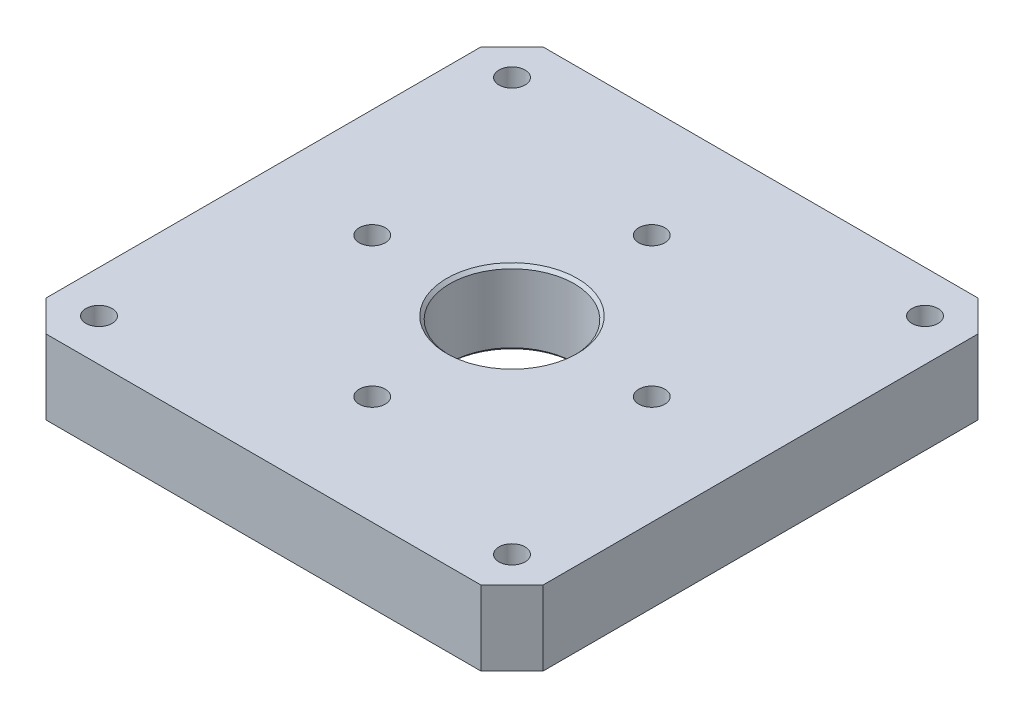
ISO-10303-21;
HEADER;
FILE_DESCRIPTION(('STEP AP214'),'2;1');
FILE_NAME('part.step','',(''),(''),'','','');
FILE_SCHEMA(('AUTOMOTIVE_DESIGN { 1 0 10303 214 1 1 1 1 }'));
ENDSEC;
DATA;
#1=APPLICATION_CONTEXT('core data for automotive mechanical design processes');
#2=APPLICATION_PROTOCOL_DEFINITION('international standard','automotive_design',2000,#1);
#3=PRODUCT_CONTEXT('',#1,'mechanical');
#4=PRODUCT('Part','Part','',(#3));
#5=PRODUCT_RELATED_PRODUCT_CATEGORY('part','',(#4));
#6=PRODUCT_DEFINITION_FORMATION('','',#4);
#7=PRODUCT_DEFINITION_CONTEXT('part definition',#1,'design');
#8=PRODUCT_DEFINITION('design','',#6,#7);
#9=PRODUCT_DEFINITION_SHAPE('','',#8);
#10=(LENGTH_UNIT() NAMED_UNIT(*) SI_UNIT(.MILLI.,.METRE.));
#11=(NAMED_UNIT(*) PLANE_ANGLE_UNIT() SI_UNIT($,.RADIAN.));
#12=(NAMED_UNIT(*) SI_UNIT($,.STERADIAN.) SOLID_ANGLE_UNIT());
#13=UNCERTAINTY_MEASURE_WITH_UNIT(LENGTH_MEASURE(1.E-05),#10,'distance_accuracy_value','');
#14=(GEOMETRIC_REPRESENTATION_CONTEXT(3) GLOBAL_UNCERTAINTY_ASSIGNED_CONTEXT((#13)) GLOBAL_UNIT_ASSIGNED_CONTEXT((#10,
#11,#12)) REPRESENTATION_CONTEXT('',''));
#15=CARTESIAN_POINT('',(0.,0.,0.));
#16=DIRECTION('',(0.,0.,1.));
#17=DIRECTION('',(1.,0.,0.));
#18=AXIS2_PLACEMENT_3D('',#15,#16,#17);
#19=CARTESIAN_POINT('',(0.,12.,0.));
#20=DIRECTION('',(0.,-1.,0.));
#21=DIRECTION('',(0.,0.,-1.));
#22=AXIS2_PLACEMENT_3D('',#19,#20,#21);
#23=PLANE('',#22);
#24=CARTESIAN_POINT('',(40.,12.,-40.));
#25=DIRECTION('',(0.,-1.,0.));
#26=DIRECTION('',(0.,0.,-1.));
#27=AXIS2_PLACEMENT_3D('',#24,#25,#26);
#28=CIRCLE('',#27,10.5);
#29=CARTESIAN_POINT('',(40.,12.,-50.5));
#30=VERTEX_POINT('',#29);
#31=EDGE_CURVE('E11',#30,#30,#28,.T.);
#32=ORIENTED_EDGE('',*,*,#31,.T.);
#33=EDGE_LOOP('',(#32));
#34=FACE_BOUND('',#33,.T.);
#35=CARTESIAN_POINT('',(6.76598128423227,12.,-73.2340187157677));
#36=DIRECTION('',(0.,1.,0.));
#37=DIRECTION('',(0.,0.,1.));
#38=AXIS2_PLACEMENT_3D('',#35,#36,#37);
#39=CIRCLE('',#38,2.1);
#40=CARTESIAN_POINT('',(6.76598128423227,12.,-71.1340187157677));
#41=VERTEX_POINT('',#40);
#42=EDGE_CURVE('E529',#41,#41,#39,.T.);
#43=ORIENTED_EDGE('',*,*,#42,.F.);
#44=EDGE_LOOP('',(#43));
#45=FACE_BOUND('',#44,.T.);
#46=CARTESIAN_POINT('',(73.2340187157677,12.,-73.2340187157677));
#47=DIRECTION('',(0.,1.,0.));
#48=DIRECTION('',(0.,0.,1.));
#49=AXIS2_PLACEMENT_3D('',#46,#47,#48);
#50=CIRCLE('',#49,2.1);
#51=CARTESIAN_POINT('',(73.2340187157677,12.,-71.1340187157677));
#52=VERTEX_POINT('',#51);
#53=EDGE_CURVE('E517',#52,#52,#50,.T.);
#54=ORIENTED_EDGE('',*,*,#53,.F.);
#55=EDGE_LOOP('',(#54));
#56=FACE_BOUND('',#55,.T.);
#57=CARTESIAN_POINT('',(62.5,12.,-40.));
#58=DIRECTION('',(0.,1.,0.));
#59=DIRECTION('',(0.,0.,1.));
#60=AXIS2_PLACEMENT_3D('',#57,#58,#59);
#61=CIRCLE('',#60,2.1);
#62=CARTESIAN_POINT('',(62.5,12.,-37.9));
#63=VERTEX_POINT('',#62);
#64=EDGE_CURVE('E511',#63,#63,#61,.T.);
#65=ORIENTED_EDGE('',*,*,#64,.F.);
#66=EDGE_LOOP('',(#65));
#67=FACE_BOUND('',#66,.T.);
#68=CARTESIAN_POINT('',(40.,12.,-17.5));
#69=DIRECTION('',(0.,1.,0.));
#70=DIRECTION('',(0.,0.,1.));
#71=AXIS2_PLACEMENT_3D('',#68,#69,#70);
#72=CIRCLE('',#71,2.1);
#73=CARTESIAN_POINT('',(40.,12.,-15.4));
#74=VERTEX_POINT('',#73);
#75=EDGE_CURVE('E505',#74,#74,#72,.T.);
#76=ORIENTED_EDGE('',*,*,#75,.F.);
#77=EDGE_LOOP('',(#76));
#78=FACE_BOUND('',#77,.T.);
#79=CARTESIAN_POINT('',(17.5,12.,-40.));
#80=DIRECTION('',(0.,1.,0.));
#81=DIRECTION('',(0.,0.,1.));
#82=AXIS2_PLACEMENT_3D('',#79,#80,#81);
#83=CIRCLE('',#82,2.1);
#84=CARTESIAN_POINT('',(17.5,12.,-37.9));
#85=VERTEX_POINT('',#84);
#86=EDGE_CURVE('E499',#85,#85,#83,.T.);
#87=ORIENTED_EDGE('',*,*,#86,.F.);
#88=EDGE_LOOP('',(#87));
#89=FACE_BOUND('',#88,.T.);
#90=CARTESIAN_POINT('',(6.76598128423226,12.,-6.76598128423226));
#91=DIRECTION('',(0.,1.,0.));
#92=DIRECTION('',(0.,0.,1.));
#93=AXIS2_PLACEMENT_3D('',#90,#91,#92);
#94=CIRCLE('',#93,2.1);
#95=CARTESIAN_POINT('',(6.76598128423226,12.,-4.66598128423226));
#96=VERTEX_POINT('',#95);
#97=EDGE_CURVE('E493',#96,#96,#94,.T.);
#98=ORIENTED_EDGE('',*,*,#97,.F.);
#99=EDGE_LOOP('',(#98));
#100=FACE_BOUND('',#99,.T.);
#101=CARTESIAN_POINT('',(73.2340187157677,12.,-6.76598128423227));
#102=DIRECTION('',(0.,1.,0.));
#103=DIRECTION('',(0.,0.,1.));
#104=AXIS2_PLACEMENT_3D('',#101,#102,#103);
#105=CIRCLE('',#104,2.1);
#106=CARTESIAN_POINT('',(73.2340187157677,12.,-4.66598128423226));
#107=VERTEX_POINT('',#106);
#108=EDGE_CURVE('E487',#107,#107,#105,.T.);
#109=ORIENTED_EDGE('',*,*,#108,.F.);
#110=EDGE_LOOP('',(#109));
#111=FACE_BOUND('',#110,.T.);
#112=DIRECTION('',(0.,0.,1.));
#113=VECTOR('',#112,1.);
#114=CARTESIAN_POINT('',(0.,12.,-5.));
#115=LINE('',#114,#113);
#116=CARTESIAN_POINT('',(0.,12.,-75.));
#117=VERTEX_POINT('',#116);
#118=CARTESIAN_POINT('',(0.,12.,-5.));
#119=VERTEX_POINT('',#118);
#120=EDGE_CURVE('E184',#117,#119,#115,.T.);
#121=ORIENTED_EDGE('',*,*,#120,.T.);
#122=DIRECTION('',(0.707106781186548,0.,0.707106781186548));
#123=VECTOR('',#122,1.);
#124=CARTESIAN_POINT('',(0.,12.,-5.));
#125=LINE('',#124,#123);
#126=CARTESIAN_POINT('',(5.,12.,0.));
#127=VERTEX_POINT('',#126);
#128=EDGE_CURVE('E120',#119,#127,#125,.T.);
#129=ORIENTED_EDGE('',*,*,#128,.T.);
#130=DIRECTION('',(1.,0.,0.));
#131=VECTOR('',#130,1.);
#132=CARTESIAN_POINT('',(5.,12.,0.));
#133=LINE('',#132,#131);
#134=CARTESIAN_POINT('',(75.,12.,0.));
#135=VERTEX_POINT('',#134);
#136=EDGE_CURVE('E469',#127,#135,#133,.T.);
#137=ORIENTED_EDGE('',*,*,#136,.T.);
#138=DIRECTION('',(0.707106781186548,0.,-0.707106781186547));
#139=VECTOR('',#138,1.);
#140=CARTESIAN_POINT('',(75.,12.,0.));
#141=LINE('',#140,#139);
#142=CARTESIAN_POINT('',(80.,12.,-5.));
#143=VERTEX_POINT('',#142);
#144=EDGE_CURVE('E475',#135,#143,#141,.T.);
#145=ORIENTED_EDGE('',*,*,#144,.T.);
#146=DIRECTION('',(0.,0.,-1.));
#147=VECTOR('',#146,1.);
#148=CARTESIAN_POINT('',(80.,12.,-5.));
#149=LINE('',#148,#147);
#150=CARTESIAN_POINT('',(80.,12.,-75.));
#151=VERTEX_POINT('',#150);
#152=EDGE_CURVE('E139',#143,#151,#149,.T.);
#153=ORIENTED_EDGE('',*,*,#152,.T.);
#154=DIRECTION('',(-0.707106781186547,0.,-0.707106781186547));
#155=VECTOR('',#154,1.);
#156=CARTESIAN_POINT('',(75.,12.,-80.));
#157=LINE('',#156,#155);
#158=CARTESIAN_POINT('',(75.,12.,-80.));
#159=VERTEX_POINT('',#158);
#160=EDGE_CURVE('E133',#151,#159,#157,.T.);
#161=ORIENTED_EDGE('',*,*,#160,.T.);
#162=DIRECTION('',(-1.,0.,0.));
#163=VECTOR('',#162,1.);
#164=CARTESIAN_POINT('',(5.,12.,-80.));
#165=LINE('',#164,#163);
#166=CARTESIAN_POINT('',(5.,12.,-80.));
#167=VERTEX_POINT('',#166);
#168=EDGE_CURVE('E137',#159,#167,#165,.T.);
#169=ORIENTED_EDGE('',*,*,#168,.T.);
#170=DIRECTION('',(-0.707106781186547,0.,0.707106781186548));
#171=VECTOR('',#170,1.);
#172=CARTESIAN_POINT('',(0.,12.,-75.));
#173=LINE('',#172,#171);
#174=EDGE_CURVE('E76',#167,#117,#173,.T.);
#175=ORIENTED_EDGE('',*,*,#174,.T.);
#176=EDGE_LOOP('',(#121,#129,#137,#145,#153,#161,#169,#175));
#177=FACE_BOUND('',#176,.T.);
#178=CARTESIAN_POINT('',(40.,12.,-62.5));
#179=DIRECTION('',(0.,1.,0.));
#180=DIRECTION('',(0.,0.,1.));
#181=AXIS2_PLACEMENT_3D('',#178,#179,#180);
#182=CIRCLE('',#181,2.1);
#183=CARTESIAN_POINT('',(40.,12.,-60.4));
#184=VERTEX_POINT('',#183);
#185=EDGE_CURVE('E523',#184,#184,#182,.T.);
#186=ORIENTED_EDGE('',*,*,#185,.F.);
#187=EDGE_LOOP('',(#186));
#188=FACE_BOUND('',#187,.T.);
#189=ADVANCED_FACE('F57',(#34,#45,#56,#67,#78,#89,#100,#111,#177,#188),#23,.F.);
#190=CARTESIAN_POINT('',(0.,12.,-5.));
#191=DIRECTION('',(1.,0.,0.));
#192=DIRECTION('',(0.,0.,-1.));
#193=AXIS2_PLACEMENT_3D('',#190,#191,#192);
#194=PLANE('',#193);
#195=DIRECTION('',(0.,0.,1.));
#196=VECTOR('',#195,1.);
#197=CARTESIAN_POINT('',(0.,0.,-5.));
#198=LINE('',#197,#196);
#199=CARTESIAN_POINT('',(0.,0.,-75.));
#200=VERTEX_POINT('',#199);
#201=CARTESIAN_POINT('',(0.,0.,-5.));
#202=VERTEX_POINT('',#201);
#203=EDGE_CURVE('E161',#200,#202,#198,.T.);
#204=ORIENTED_EDGE('',*,*,#203,.T.);
#205=DIRECTION('',(0.,-1.,0.));
#206=VECTOR('',#205,1.);
#207=CARTESIAN_POINT('',(0.,12.,-5.));
#208=LINE('',#207,#206);
#209=EDGE_CURVE('E203',#119,#202,#208,.T.);
#210=ORIENTED_EDGE('',*,*,#209,.F.);
#211=ORIENTED_EDGE('',*,*,#120,.F.);
#212=DIRECTION('',(0.,-1.,0.));
#213=VECTOR('',#212,1.);
#214=CARTESIAN_POINT('',(0.,12.,-75.));
#215=LINE('',#214,#213);
#216=EDGE_CURVE('E157',#117,#200,#215,.T.);
#217=ORIENTED_EDGE('',*,*,#216,.T.);
#218=EDGE_LOOP('',(#204,#210,#211,#217));
#219=FACE_BOUND('',#218,.T.);
#220=ADVANCED_FACE('F266',(#219),#194,.F.);
#221=CARTESIAN_POINT('',(0.,12.,-5.));
#222=DIRECTION('',(0.707106781186547,0.,-0.707106781186547));
#223=DIRECTION('',(-0.707106781186548,0.,-0.707106781186548));
#224=AXIS2_PLACEMENT_3D('',#221,#222,#223);
#225=PLANE('',#224);
#226=DIRECTION('',(0.707106781186548,0.,0.707106781186548));
#227=VECTOR('',#226,1.);
#228=CARTESIAN_POINT('',(0.,0.,-5.));
#229=LINE('',#228,#227);
#230=CARTESIAN_POINT('',(5.,0.,0.));
#231=VERTEX_POINT('',#230);
#232=EDGE_CURVE('E165',#202,#231,#229,.T.);
#233=ORIENTED_EDGE('',*,*,#232,.T.);
#234=DIRECTION('',(0.,-1.,0.));
#235=VECTOR('',#234,1.);
#236=CARTESIAN_POINT('',(5.,12.,0.));
#237=LINE('',#236,#235);
#238=EDGE_CURVE('E199',#127,#231,#237,.T.);
#239=ORIENTED_EDGE('',*,*,#238,.F.);
#240=ORIENTED_EDGE('',*,*,#128,.F.);
#241=ORIENTED_EDGE('',*,*,#209,.T.);
#242=EDGE_LOOP('',(#233,#239,#240,#241));
#243=FACE_BOUND('',#242,.T.);
#244=ADVANCED_FACE('F282',(#243),#225,.F.);
#245=CARTESIAN_POINT('',(5.,12.,0.));
#246=DIRECTION('',(0.,0.,-1.));
#247=DIRECTION('',(-1.,0.,0.));
#248=AXIS2_PLACEMENT_3D('',#245,#246,#247);
#249=PLANE('',#248);
#250=DIRECTION('',(1.,0.,0.));
#251=VECTOR('',#250,1.);
#252=CARTESIAN_POINT('',(5.,0.,0.));
#253=LINE('',#252,#251);
#254=CARTESIAN_POINT('',(75.,0.,0.));
#255=VERTEX_POINT('',#254);
#256=EDGE_CURVE('E169',#231,#255,#253,.T.);
#257=ORIENTED_EDGE('',*,*,#256,.T.);
#258=DIRECTION('',(0.,-1.,0.));
#259=VECTOR('',#258,1.);
#260=CARTESIAN_POINT('',(75.,12.,0.));
#261=LINE('',#260,#259);
#262=EDGE_CURVE('E195',#135,#255,#261,.T.);
#263=ORIENTED_EDGE('',*,*,#262,.F.);
#264=ORIENTED_EDGE('',*,*,#136,.F.);
#265=ORIENTED_EDGE('',*,*,#238,.T.);
#266=EDGE_LOOP('',(#257,#263,#264,#265));
#267=FACE_BOUND('',#266,.T.);
#268=ADVANCED_FACE('F431',(#267),#249,.F.);
#269=CARTESIAN_POINT('',(75.,12.,0.));
#270=DIRECTION('',(-0.707106781186547,0.,-0.707106781186548));
#271=DIRECTION('',(-0.707106781186548,0.,0.707106781186547));
#272=AXIS2_PLACEMENT_3D('',#269,#270,#271);
#273=PLANE('',#272);
#274=DIRECTION('',(0.707106781186548,0.,-0.707106781186547));
#275=VECTOR('',#274,1.);
#276=CARTESIAN_POINT('',(75.,0.,0.));
#277=LINE('',#276,#275);
#278=CARTESIAN_POINT('',(80.,0.,-5.));
#279=VERTEX_POINT('',#278);
#280=EDGE_CURVE('E172',#255,#279,#277,.T.);
#281=ORIENTED_EDGE('',*,*,#280,.T.);
#282=DIRECTION('',(0.,-1.,0.));
#283=VECTOR('',#282,1.);
#284=CARTESIAN_POINT('',(80.,12.,-5.));
#285=LINE('',#284,#283);
#286=EDGE_CURVE('E191',#143,#279,#285,.T.);
#287=ORIENTED_EDGE('',*,*,#286,.F.);
#288=ORIENTED_EDGE('',*,*,#144,.F.);
#289=ORIENTED_EDGE('',*,*,#262,.T.);
#290=EDGE_LOOP('',(#281,#287,#288,#289));
#291=FACE_BOUND('',#290,.T.);
#292=ADVANCED_FACE('F422',(#291),#273,.F.);
#293=CARTESIAN_POINT('',(80.,12.,-5.));
#294=DIRECTION('',(-1.,0.,0.));
#295=DIRECTION('',(0.,0.,1.));
#296=AXIS2_PLACEMENT_3D('',#293,#294,#295);
#297=PLANE('',#296);
#298=DIRECTION('',(0.,0.,-1.));
#299=VECTOR('',#298,1.);
#300=CARTESIAN_POINT('',(80.,0.,-5.));
#301=LINE('',#300,#299);
#302=CARTESIAN_POINT('',(80.,0.,-75.));
#303=VERTEX_POINT('',#302);
#304=EDGE_CURVE('E175',#279,#303,#301,.T.);
#305=ORIENTED_EDGE('',*,*,#304,.T.);
#306=DIRECTION('',(0.,-1.,0.));
#307=VECTOR('',#306,1.);
#308=CARTESIAN_POINT('',(80.,12.,-75.));
#309=LINE('',#308,#307);
#310=EDGE_CURVE('E150',#151,#303,#309,.T.);
#311=ORIENTED_EDGE('',*,*,#310,.F.);
#312=ORIENTED_EDGE('',*,*,#152,.F.);
#313=ORIENTED_EDGE('',*,*,#286,.T.);
#314=EDGE_LOOP('',(#305,#311,#312,#313));
#315=FACE_BOUND('',#314,.T.);
#316=ADVANCED_FACE('F414',(#315),#297,.F.);
#317=CARTESIAN_POINT('',(75.,12.,-80.));
#318=DIRECTION('',(-0.707106781186548,0.,0.707106781186548));
#319=DIRECTION('',(0.707106781186548,0.,0.707106781186548));
#320=AXIS2_PLACEMENT_3D('',#317,#318,#319);
#321=PLANE('',#320);
#322=DIRECTION('',(-0.707106781186547,0.,-0.707106781186547));
#323=VECTOR('',#322,1.);
#324=CARTESIAN_POINT('',(75.,0.,-80.));
#325=LINE('',#324,#323);
#326=CARTESIAN_POINT('',(75.,0.,-80.));
#327=VERTEX_POINT('',#326);
#328=EDGE_CURVE('E148',#303,#327,#325,.T.);
#329=ORIENTED_EDGE('',*,*,#328,.T.);
#330=DIRECTION('',(0.,-1.,0.));
#331=VECTOR('',#330,1.);
#332=CARTESIAN_POINT('',(75.,12.,-80.));
#333=LINE('',#332,#331);
#334=EDGE_CURVE('E145',#159,#327,#333,.T.);
#335=ORIENTED_EDGE('',*,*,#334,.F.);
#336=ORIENTED_EDGE('',*,*,#160,.F.);
#337=ORIENTED_EDGE('',*,*,#310,.T.);
#338=EDGE_LOOP('',(#329,#335,#336,#337));
#339=FACE_BOUND('',#338,.T.);
#340=ADVANCED_FACE('F146',(#339),#321,.F.);
#341=CARTESIAN_POINT('',(5.,12.,-80.));
#342=DIRECTION('',(0.,0.,1.));
#343=DIRECTION('',(1.,0.,0.));
#344=AXIS2_PLACEMENT_3D('',#341,#342,#343);
#345=PLANE('',#344);
#346=DIRECTION('',(-1.,0.,0.));
#347=VECTOR('',#346,1.);
#348=CARTESIAN_POINT('',(5.,0.,-80.));
#349=LINE('',#348,#347);
#350=CARTESIAN_POINT('',(5.,0.,-80.));
#351=VERTEX_POINT('',#350);
#352=EDGE_CURVE('E105',#327,#351,#349,.T.);
#353=ORIENTED_EDGE('',*,*,#352,.T.);
#354=DIRECTION('',(0.,-1.,0.));
#355=VECTOR('',#354,1.);
#356=CARTESIAN_POINT('',(5.,12.,-80.));
#357=LINE('',#356,#355);
#358=EDGE_CURVE('E151',#167,#351,#357,.T.);
#359=ORIENTED_EDGE('',*,*,#358,.F.);
#360=ORIENTED_EDGE('',*,*,#168,.F.);
#361=ORIENTED_EDGE('',*,*,#334,.T.);
#362=EDGE_LOOP('',(#353,#359,#360,#361));
#363=FACE_BOUND('',#362,.T.);
#364=ADVANCED_FACE('F153',(#363),#345,.F.);
#365=CARTESIAN_POINT('',(0.,12.,-75.));
#366=DIRECTION('',(0.707106781186548,0.,0.707106781186547));
#367=DIRECTION('',(0.707106781186547,0.,-0.707106781186548));
#368=AXIS2_PLACEMENT_3D('',#365,#366,#367);
#369=PLANE('',#368);
#370=DIRECTION('',(-0.707106781186547,0.,0.707106781186548));
#371=VECTOR('',#370,1.);
#372=CARTESIAN_POINT('',(0.,0.,-75.));
#373=LINE('',#372,#371);
#374=EDGE_CURVE('E111',#351,#200,#373,.T.);
#375=ORIENTED_EDGE('',*,*,#374,.T.);
#376=ORIENTED_EDGE('',*,*,#216,.F.);
#377=ORIENTED_EDGE('',*,*,#174,.F.);
#378=ORIENTED_EDGE('',*,*,#358,.T.);
#379=EDGE_LOOP('',(#375,#376,#377,#378));
#380=FACE_BOUND('',#379,.T.);
#381=ADVANCED_FACE('F229',(#380),#369,.F.);
#382=CARTESIAN_POINT('',(0.,0.,0.));
#383=DIRECTION('',(0.,-1.,0.));
#384=DIRECTION('',(0.,0.,-1.));
#385=AXIS2_PLACEMENT_3D('',#382,#383,#384);
#386=PLANE('',#385);
#387=CARTESIAN_POINT('',(40.,0.,-40.));
#388=DIRECTION('',(0.,-1.,0.));
#389=DIRECTION('',(0.,0.,-1.));
#390=AXIS2_PLACEMENT_3D('',#387,#388,#389);
#391=CIRCLE('',#390,10.5);
#392=CARTESIAN_POINT('',(40.,0.,-50.5));
#393=VERTEX_POINT('',#392);
#394=EDGE_CURVE('E206',#393,#393,#391,.F.);
#395=ORIENTED_EDGE('',*,*,#394,.T.);
#396=EDGE_LOOP('',(#395));
#397=FACE_BOUND('',#396,.T.);
#398=CARTESIAN_POINT('',(6.76598128423227,0.,-73.2340187157677));
#399=DIRECTION('',(0.,1.,0.));
#400=DIRECTION('',(0.,0.,1.));
#401=AXIS2_PLACEMENT_3D('',#398,#399,#400);
#402=CIRCLE('',#401,2.1);
#403=CARTESIAN_POINT('',(6.76598128423227,0.,-71.1340187157677));
#404=VERTEX_POINT('',#403);
#405=EDGE_CURVE('E234',#404,#404,#402,.T.);
#406=ORIENTED_EDGE('',*,*,#405,.T.);
#407=EDGE_LOOP('',(#406));
#408=FACE_BOUND('',#407,.T.);
#409=CARTESIAN_POINT('',(40.,0.,-62.5));
#410=DIRECTION('',(0.,1.,0.));
#411=DIRECTION('',(0.,0.,1.));
#412=AXIS2_PLACEMENT_3D('',#409,#410,#411);
#413=CIRCLE('',#412,2.1);
#414=CARTESIAN_POINT('',(40.,0.,-60.4));
#415=VERTEX_POINT('',#414);
#416=EDGE_CURVE('E238',#415,#415,#413,.T.);
#417=ORIENTED_EDGE('',*,*,#416,.T.);
#418=EDGE_LOOP('',(#417));
#419=FACE_BOUND('',#418,.T.);
#420=CARTESIAN_POINT('',(73.2340187157677,0.,-73.2340187157677));
#421=DIRECTION('',(0.,1.,0.));
#422=DIRECTION('',(0.,0.,1.));
#423=AXIS2_PLACEMENT_3D('',#420,#421,#422);
#424=CIRCLE('',#423,2.09999999999999);
#425=CARTESIAN_POINT('',(73.2340187157677,0.,-71.1340187157677));
#426=VERTEX_POINT('',#425);
#427=EDGE_CURVE('E242',#426,#426,#424,.T.);
#428=ORIENTED_EDGE('',*,*,#427,.T.);
#429=EDGE_LOOP('',(#428));
#430=FACE_BOUND('',#429,.T.);
#431=CARTESIAN_POINT('',(62.5,0.,-40.));
#432=DIRECTION('',(0.,1.,0.));
#433=DIRECTION('',(0.,0.,1.));
#434=AXIS2_PLACEMENT_3D('',#431,#432,#433);
#435=CIRCLE('',#434,2.09999999999999);
#436=CARTESIAN_POINT('',(62.5,0.,-37.9));
#437=VERTEX_POINT('',#436);
#438=EDGE_CURVE('E246',#437,#437,#435,.T.);
#439=ORIENTED_EDGE('',*,*,#438,.T.);
#440=EDGE_LOOP('',(#439));
#441=FACE_BOUND('',#440,.T.);
#442=CARTESIAN_POINT('',(40.,0.,-17.5));
#443=DIRECTION('',(0.,1.,0.));
#444=DIRECTION('',(0.,0.,1.));
#445=AXIS2_PLACEMENT_3D('',#442,#443,#444);
#446=CIRCLE('',#445,2.1);
#447=CARTESIAN_POINT('',(40.,0.,-15.4));
#448=VERTEX_POINT('',#447);
#449=EDGE_CURVE('E250',#448,#448,#446,.T.);
#450=ORIENTED_EDGE('',*,*,#449,.T.);
#451=EDGE_LOOP('',(#450));
#452=FACE_BOUND('',#451,.T.);
#453=CARTESIAN_POINT('',(17.5,0.,-40.));
#454=DIRECTION('',(0.,1.,0.));
#455=DIRECTION('',(0.,0.,1.));
#456=AXIS2_PLACEMENT_3D('',#453,#454,#455);
#457=CIRCLE('',#456,2.1);
#458=CARTESIAN_POINT('',(17.5,0.,-37.9));
#459=VERTEX_POINT('',#458);
#460=EDGE_CURVE('E254',#459,#459,#457,.T.);
#461=ORIENTED_EDGE('',*,*,#460,.T.);
#462=EDGE_LOOP('',(#461));
#463=FACE_BOUND('',#462,.T.);
#464=CARTESIAN_POINT('',(6.76598128423226,0.,-6.76598128423226));
#465=DIRECTION('',(0.,1.,0.));
#466=DIRECTION('',(0.,0.,1.));
#467=AXIS2_PLACEMENT_3D('',#464,#465,#466);
#468=CIRCLE('',#467,2.1);
#469=CARTESIAN_POINT('',(6.76598128423226,0.,-4.66598128423226));
#470=VERTEX_POINT('',#469);
#471=EDGE_CURVE('E258',#470,#470,#468,.T.);
#472=ORIENTED_EDGE('',*,*,#471,.T.);
#473=EDGE_LOOP('',(#472));
#474=FACE_BOUND('',#473,.T.);
#475=CARTESIAN_POINT('',(73.2340187157677,0.,-6.76598128423227));
#476=DIRECTION('',(0.,1.,0.));
#477=DIRECTION('',(0.,0.,1.));
#478=AXIS2_PLACEMENT_3D('',#475,#476,#477);
#479=CIRCLE('',#478,2.09999999999999);
#480=CARTESIAN_POINT('',(73.2340187157677,0.,-4.66598128423228));
#481=VERTEX_POINT('',#480);
#482=EDGE_CURVE('E166',#481,#481,#479,.T.);
#483=ORIENTED_EDGE('',*,*,#482,.T.);
#484=EDGE_LOOP('',(#483));
#485=FACE_BOUND('',#484,.T.);
#486=ORIENTED_EDGE('',*,*,#203,.F.);
#487=ORIENTED_EDGE('',*,*,#374,.F.);
#488=ORIENTED_EDGE('',*,*,#352,.F.);
#489=ORIENTED_EDGE('',*,*,#328,.F.);
#490=ORIENTED_EDGE('',*,*,#304,.F.);
#491=ORIENTED_EDGE('',*,*,#280,.F.);
#492=ORIENTED_EDGE('',*,*,#256,.F.);
#493=ORIENTED_EDGE('',*,*,#232,.F.);
#494=EDGE_LOOP('',(#486,#487,#488,#489,#490,#491,#492,#493));
#495=FACE_BOUND('',#494,.T.);
#496=ADVANCED_FACE('F225',(#397,#408,#419,#430,#441,#452,#463,#474,#485,#495),#386,.T.);
#497=CARTESIAN_POINT('',(73.2340187157677,12.,-6.76598128423227));
#498=DIRECTION('',(0.,1.,0.));
#499=DIRECTION('',(0.,0.,1.));
#500=AXIS2_PLACEMENT_3D('',#497,#498,#499);
#501=CYLINDRICAL_SURFACE('',#500,2.1);
#502=ORIENTED_EDGE('',*,*,#482,.F.);
#503=EDGE_LOOP('',(#502));
#504=FACE_BOUND('',#503,.T.);
#505=ORIENTED_EDGE('',*,*,#108,.T.);
#506=EDGE_LOOP('',(#505));
#507=FACE_BOUND('',#506,.T.);
#508=ADVANCED_FACE('F228',(#504,#507),#501,.F.);
#509=CARTESIAN_POINT('',(6.76598128423226,12.,-6.76598128423226));
#510=DIRECTION('',(0.,1.,0.));
#511=DIRECTION('',(0.,0.,1.));
#512=AXIS2_PLACEMENT_3D('',#509,#510,#511);
#513=CYLINDRICAL_SURFACE('',#512,2.1);
#514=ORIENTED_EDGE('',*,*,#471,.F.);
#515=EDGE_LOOP('',(#514));
#516=FACE_BOUND('',#515,.T.);
#517=ORIENTED_EDGE('',*,*,#97,.T.);
#518=EDGE_LOOP('',(#517));
#519=FACE_BOUND('',#518,.T.);
#520=ADVANCED_FACE('F288',(#516,#519),#513,.F.);
#521=CARTESIAN_POINT('',(17.5,12.,-40.));
#522=DIRECTION('',(0.,1.,0.));
#523=DIRECTION('',(0.,0.,1.));
#524=AXIS2_PLACEMENT_3D('',#521,#522,#523);
#525=CYLINDRICAL_SURFACE('',#524,2.1);
#526=ORIENTED_EDGE('',*,*,#460,.F.);
#527=EDGE_LOOP('',(#526));
#528=FACE_BOUND('',#527,.T.);
#529=ORIENTED_EDGE('',*,*,#86,.T.);
#530=EDGE_LOOP('',(#529));
#531=FACE_BOUND('',#530,.T.);
#532=ADVANCED_FACE('F292',(#528,#531),#525,.F.);
#533=CARTESIAN_POINT('',(40.,12.,-17.5));
#534=DIRECTION('',(0.,1.,0.));
#535=DIRECTION('',(0.,0.,1.));
#536=AXIS2_PLACEMENT_3D('',#533,#534,#535);
#537=CYLINDRICAL_SURFACE('',#536,2.1);
#538=ORIENTED_EDGE('',*,*,#449,.F.);
#539=EDGE_LOOP('',(#538));
#540=FACE_BOUND('',#539,.T.);
#541=ORIENTED_EDGE('',*,*,#75,.T.);
#542=EDGE_LOOP('',(#541));
#543=FACE_BOUND('',#542,.T.);
#544=ADVANCED_FACE('F296',(#540,#543),#537,.F.);
#545=CARTESIAN_POINT('',(62.5,12.,-40.));
#546=DIRECTION('',(0.,1.,0.));
#547=DIRECTION('',(0.,0.,1.));
#548=AXIS2_PLACEMENT_3D('',#545,#546,#547);
#549=CYLINDRICAL_SURFACE('',#548,2.1);
#550=ORIENTED_EDGE('',*,*,#438,.F.);
#551=EDGE_LOOP('',(#550));
#552=FACE_BOUND('',#551,.T.);
#553=ORIENTED_EDGE('',*,*,#64,.T.);
#554=EDGE_LOOP('',(#553));
#555=FACE_BOUND('',#554,.T.);
#556=ADVANCED_FACE('F300',(#552,#555),#549,.F.);
#557=CARTESIAN_POINT('',(73.2340187157677,12.,-73.2340187157677));
#558=DIRECTION('',(0.,1.,0.));
#559=DIRECTION('',(0.,0.,1.));
#560=AXIS2_PLACEMENT_3D('',#557,#558,#559);
#561=CYLINDRICAL_SURFACE('',#560,2.1);
#562=ORIENTED_EDGE('',*,*,#427,.F.);
#563=EDGE_LOOP('',(#562));
#564=FACE_BOUND('',#563,.T.);
#565=ORIENTED_EDGE('',*,*,#53,.T.);
#566=EDGE_LOOP('',(#565));
#567=FACE_BOUND('',#566,.T.);
#568=ADVANCED_FACE('F304',(#564,#567),#561,.F.);
#569=CARTESIAN_POINT('',(40.,12.,-62.5));
#570=DIRECTION('',(0.,1.,0.));
#571=DIRECTION('',(0.,0.,1.));
#572=AXIS2_PLACEMENT_3D('',#569,#570,#571);
#573=CYLINDRICAL_SURFACE('',#572,2.1);
#574=ORIENTED_EDGE('',*,*,#416,.F.);
#575=EDGE_LOOP('',(#574));
#576=FACE_BOUND('',#575,.T.);
#577=ORIENTED_EDGE('',*,*,#185,.T.);
#578=EDGE_LOOP('',(#577));
#579=FACE_BOUND('',#578,.T.);
#580=ADVANCED_FACE('F308',(#576,#579),#573,.F.);
#581=CARTESIAN_POINT('',(6.76598128423227,12.,-73.2340187157677));
#582=DIRECTION('',(0.,1.,0.));
#583=DIRECTION('',(0.,0.,1.));
#584=AXIS2_PLACEMENT_3D('',#581,#582,#583);
#585=CYLINDRICAL_SURFACE('',#584,2.1);
#586=ORIENTED_EDGE('',*,*,#405,.F.);
#587=EDGE_LOOP('',(#586));
#588=FACE_BOUND('',#587,.T.);
#589=ORIENTED_EDGE('',*,*,#42,.T.);
#590=EDGE_LOOP('',(#589));
#591=FACE_BOUND('',#590,.T.);
#592=ADVANCED_FACE('F312',(#588,#591),#585,.F.);
#593=CARTESIAN_POINT('',(40.,0.,-40.));
#594=DIRECTION('',(0.,1.,0.));
#595=DIRECTION('',(0.,0.,1.));
#596=AXIS2_PLACEMENT_3D('',#593,#594,#595);
#597=CYLINDRICAL_SURFACE('',#596,10.);
#598=CARTESIAN_POINT('',(40.,0.499999999999987,-40.));
#599=DIRECTION('',(0.,-1.,0.));
#600=DIRECTION('',(0.,0.,-1.));
#601=AXIS2_PLACEMENT_3D('',#598,#599,#600);
#602=CIRCLE('',#601,10.);
#603=CARTESIAN_POINT('',(40.,0.499999999999987,-50.));
#604=VERTEX_POINT('',#603);
#605=EDGE_CURVE('E68',#604,#604,#602,.T.);
#606=ORIENTED_EDGE('',*,*,#605,.T.);
#607=EDGE_LOOP('',(#606));
#608=FACE_BOUND('',#607,.T.);
#609=CARTESIAN_POINT('',(40.,11.5,-40.));
#610=DIRECTION('',(0.,-1.,0.));
#611=DIRECTION('',(0.,0.,-1.));
#612=AXIS2_PLACEMENT_3D('',#609,#610,#611);
#613=CIRCLE('',#612,10.);
#614=CARTESIAN_POINT('',(40.,11.5,-50.));
#615=VERTEX_POINT('',#614);
#616=EDGE_CURVE('E210',#615,#615,#613,.F.);
#617=ORIENTED_EDGE('',*,*,#616,.T.);
#618=EDGE_LOOP('',(#617));
#619=FACE_BOUND('',#618,.T.);
#620=ADVANCED_FACE('F217',(#608,#619),#597,.F.);
#621=CARTESIAN_POINT('',(40.,0.,-40.));
#622=DIRECTION('',(0.,-1.,0.));
#623=DIRECTION('',(0.,0.,-1.));
#624=AXIS2_PLACEMENT_3D('',#621,#622,#623);
#625=CONICAL_SURFACE('',#624,10.5,0.785398163397455);
#626=ORIENTED_EDGE('',*,*,#605,.F.);
#627=EDGE_LOOP('',(#626));
#628=FACE_BOUND('',#627,.T.);
#629=ORIENTED_EDGE('',*,*,#394,.F.);
#630=EDGE_LOOP('',(#629));
#631=FACE_BOUND('',#630,.T.);
#632=ADVANCED_FACE('F220',(#628,#631),#625,.F.);
#633=CARTESIAN_POINT('',(40.,11.5,-40.));
#634=DIRECTION('',(0.,1.,0.));
#635=DIRECTION('',(0.,0.,1.));
#636=AXIS2_PLACEMENT_3D('',#633,#634,#635);
#637=CONICAL_SURFACE('',#636,10.,0.785398163397441);
#638=ORIENTED_EDGE('',*,*,#31,.F.);
#639=EDGE_LOOP('',(#638));
#640=FACE_BOUND('',#639,.T.);
#641=ORIENTED_EDGE('',*,*,#616,.F.);
#642=EDGE_LOOP('',(#641));
#643=FACE_BOUND('',#642,.T.);
#644=ADVANCED_FACE('F60',(#640,#643),#637,.F.);
#645=CLOSED_SHELL('',(#189,#220,#244,#268,#292,#316,#340,#364,#381,#496,#508,#520,#532,#544,
#556,#568,#580,#592,#620,#632,#644));
#646=MANIFOLD_SOLID_BREP('B2',#645);
#647=ADVANCED_BREP_SHAPE_REPRESENTATION('',(#18,#646),#14);
#648=SHAPE_DEFINITION_REPRESENTATION(#9,#647);
ENDSEC;
END-ISO-10303-21;
